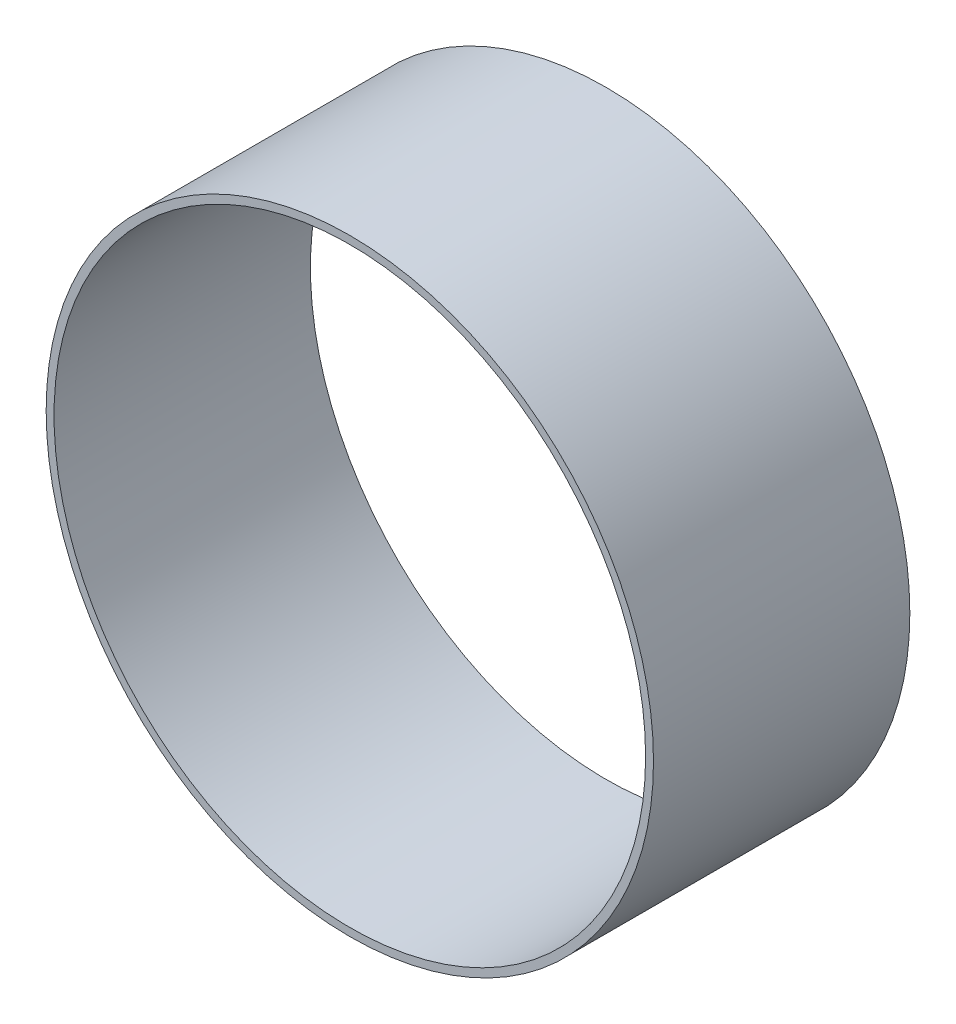
ISO-10303-21;
HEADER;
FILE_DESCRIPTION(('STEP AP214'),'2;1');
FILE_NAME('part.step','',(''),(''),'','','');
FILE_SCHEMA(('AUTOMOTIVE_DESIGN { 1 0 10303 214 1 1 1 1 }'));
ENDSEC;
DATA;
#1=APPLICATION_CONTEXT('core data for automotive mechanical design processes');
#2=APPLICATION_PROTOCOL_DEFINITION('international standard','automotive_design',2000,#1);
#3=PRODUCT_CONTEXT('',#1,'mechanical');
#4=PRODUCT('Part','Part','',(#3));
#5=PRODUCT_RELATED_PRODUCT_CATEGORY('part','',(#4));
#6=PRODUCT_DEFINITION_FORMATION('','',#4);
#7=PRODUCT_DEFINITION_CONTEXT('part definition',#1,'design');
#8=PRODUCT_DEFINITION('design','',#6,#7);
#9=PRODUCT_DEFINITION_SHAPE('','',#8);
#10=(LENGTH_UNIT() NAMED_UNIT(*) SI_UNIT(.MILLI.,.METRE.));
#11=(NAMED_UNIT(*) PLANE_ANGLE_UNIT() SI_UNIT($,.RADIAN.));
#12=(NAMED_UNIT(*) SI_UNIT($,.STERADIAN.) SOLID_ANGLE_UNIT());
#13=UNCERTAINTY_MEASURE_WITH_UNIT(LENGTH_MEASURE(1.E-05),#10,'distance_accuracy_value','');
#14=(GEOMETRIC_REPRESENTATION_CONTEXT(3) GLOBAL_UNCERTAINTY_ASSIGNED_CONTEXT((#13)) GLOBAL_UNIT_ASSIGNED_CONTEXT((#10,
#11,#12)) REPRESENTATION_CONTEXT('',''));
#15=CARTESIAN_POINT('',(0.,0.,0.));
#16=DIRECTION('',(0.,0.,1.));
#17=DIRECTION('',(1.,0.,0.));
#18=AXIS2_PLACEMENT_3D('',#15,#16,#17);
#19=CARTESIAN_POINT('',(0.,0.,33.));
#20=DIRECTION('',(0.,0.,1.));
#21=DIRECTION('',(1.,0.,0.));
#22=AXIS2_PLACEMENT_3D('',#19,#20,#21);
#23=PLANE('',#22);
#24=CARTESIAN_POINT('',(0.,0.,33.));
#25=DIRECTION('',(0.,0.,1.));
#26=DIRECTION('',(1.,0.,0.));
#27=AXIS2_PLACEMENT_3D('',#24,#25,#26);
#28=CIRCLE('',#27,77.);
#29=CARTESIAN_POINT('',(77.,0.,33.));
#30=VERTEX_POINT('',#29);
#31=EDGE_CURVE('E10',#30,#30,#28,.T.);
#32=ORIENTED_EDGE('',*,*,#31,.T.);
#33=EDGE_LOOP('',(#32));
#34=FACE_BOUND('',#33,.T.);
#35=CARTESIAN_POINT('',(0.,0.,33.));
#36=DIRECTION('',(0.,0.,1.));
#37=DIRECTION('',(1.,0.,0.));
#38=AXIS2_PLACEMENT_3D('',#35,#36,#37);
#39=CIRCLE('',#38,75.);
#40=CARTESIAN_POINT('',(75.,0.,33.));
#41=VERTEX_POINT('',#40);
#42=EDGE_CURVE('E50',#41,#41,#39,.T.);
#43=ORIENTED_EDGE('',*,*,#42,.F.);
#44=EDGE_LOOP('',(#43));
#45=FACE_BOUND('',#44,.T.);
#46=ADVANCED_FACE('F36',(#34,#45),#23,.T.);
#47=CARTESIAN_POINT('',(0.,0.,-32.));
#48=DIRECTION('',(0.,0.,1.));
#49=DIRECTION('',(1.,0.,0.));
#50=AXIS2_PLACEMENT_3D('',#47,#48,#49);
#51=PLANE('',#50);
#52=CARTESIAN_POINT('',(0.,0.,-32.));
#53=DIRECTION('',(0.,0.,1.));
#54=DIRECTION('',(1.,0.,0.));
#55=AXIS2_PLACEMENT_3D('',#52,#53,#54);
#56=CIRCLE('',#55,77.);
#57=CARTESIAN_POINT('',(77.,0.,-32.));
#58=VERTEX_POINT('',#57);
#59=EDGE_CURVE('E40',#58,#58,#56,.T.);
#60=ORIENTED_EDGE('',*,*,#59,.F.);
#61=EDGE_LOOP('',(#60));
#62=FACE_BOUND('',#61,.T.);
#63=CARTESIAN_POINT('',(0.,0.,-32.));
#64=DIRECTION('',(0.,0.,1.));
#65=DIRECTION('',(1.,0.,0.));
#66=AXIS2_PLACEMENT_3D('',#63,#64,#65);
#67=CIRCLE('',#66,75.);
#68=CARTESIAN_POINT('',(75.,0.,-32.));
#69=VERTEX_POINT('',#68);
#70=EDGE_CURVE('E52',#69,#69,#67,.T.);
#71=ORIENTED_EDGE('',*,*,#70,.T.);
#72=EDGE_LOOP('',(#71));
#73=FACE_BOUND('',#72,.T.);
#74=ADVANCED_FACE('F63',(#62,#73),#51,.F.);
#75=CARTESIAN_POINT('',(0.,0.,33.));
#76=DIRECTION('',(0.,0.,-1.));
#77=DIRECTION('',(-1.,0.,0.));
#78=AXIS2_PLACEMENT_3D('',#75,#76,#77);
#79=CYLINDRICAL_SURFACE('',#78,77.);
#80=ORIENTED_EDGE('',*,*,#31,.F.);
#81=EDGE_LOOP('',(#80));
#82=FACE_BOUND('',#81,.T.);
#83=ORIENTED_EDGE('',*,*,#59,.T.);
#84=EDGE_LOOP('',(#83));
#85=FACE_BOUND('',#84,.T.);
#86=ADVANCED_FACE('F38',(#82,#85),#79,.T.);
#87=CARTESIAN_POINT('',(0.,0.,33.));
#88=DIRECTION('',(0.,0.,-1.));
#89=DIRECTION('',(-1.,0.,0.));
#90=AXIS2_PLACEMENT_3D('',#87,#88,#89);
#91=CYLINDRICAL_SURFACE('',#90,75.);
#92=ORIENTED_EDGE('',*,*,#42,.T.);
#93=EDGE_LOOP('',(#92));
#94=FACE_BOUND('',#93,.T.);
#95=ORIENTED_EDGE('',*,*,#70,.F.);
#96=EDGE_LOOP('',(#95));
#97=FACE_BOUND('',#96,.T.);
#98=ADVANCED_FACE('F59',(#94,#97),#91,.F.);
#99=CLOSED_SHELL('',(#46,#74,#86,#98));
#100=MANIFOLD_SOLID_BREP('B2',#99);
#101=ADVANCED_BREP_SHAPE_REPRESENTATION('',(#18,#100),#14);
#102=SHAPE_DEFINITION_REPRESENTATION(#9,#101);
ENDSEC;
END-ISO-10303-21;
